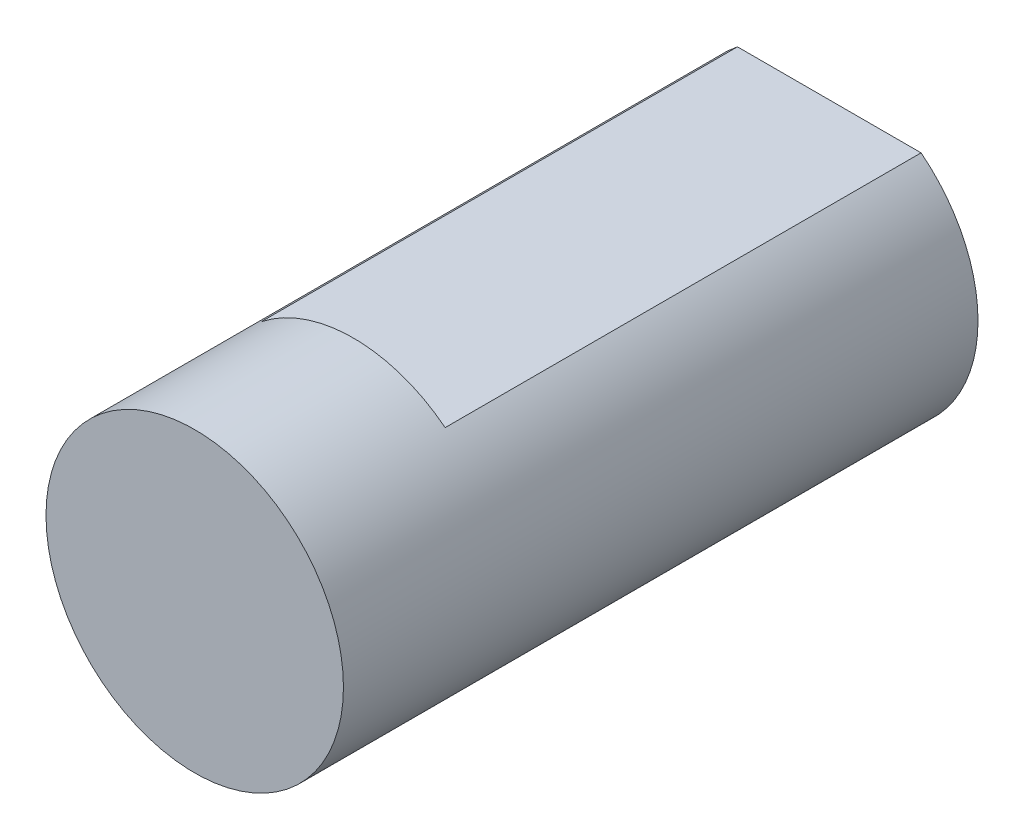
ISO-10303-21;
HEADER;
FILE_DESCRIPTION(('STEP AP214'),'2;1');
FILE_NAME('part.step','',(''),(''),'','','');
FILE_SCHEMA(('AUTOMOTIVE_DESIGN { 1 0 10303 214 1 1 1 1 }'));
ENDSEC;
DATA;
#1=APPLICATION_CONTEXT('core data for automotive mechanical design processes');
#2=APPLICATION_PROTOCOL_DEFINITION('international standard','automotive_design',2000,#1);
#3=PRODUCT_CONTEXT('',#1,'mechanical');
#4=PRODUCT('Part','Part','',(#3));
#5=PRODUCT_RELATED_PRODUCT_CATEGORY('part','',(#4));
#6=PRODUCT_DEFINITION_FORMATION('','',#4);
#7=PRODUCT_DEFINITION_CONTEXT('part definition',#1,'design');
#8=PRODUCT_DEFINITION('design','',#6,#7);
#9=PRODUCT_DEFINITION_SHAPE('','',#8);
#10=(LENGTH_UNIT() NAMED_UNIT(*) SI_UNIT(.MILLI.,.METRE.));
#11=(NAMED_UNIT(*) PLANE_ANGLE_UNIT() SI_UNIT($,.RADIAN.));
#12=(NAMED_UNIT(*) SI_UNIT($,.STERADIAN.) SOLID_ANGLE_UNIT());
#13=UNCERTAINTY_MEASURE_WITH_UNIT(LENGTH_MEASURE(1.E-05),#10,'distance_accuracy_value','');
#14=(GEOMETRIC_REPRESENTATION_CONTEXT(3) GLOBAL_UNCERTAINTY_ASSIGNED_CONTEXT((#13)) GLOBAL_UNIT_ASSIGNED_CONTEXT((#10,
#11,#12)) REPRESENTATION_CONTEXT('',''));
#15=CARTESIAN_POINT('',(0.,0.,0.));
#16=DIRECTION('',(0.,0.,1.));
#17=DIRECTION('',(1.,0.,0.));
#18=AXIS2_PLACEMENT_3D('',#15,#16,#17);
#19=CARTESIAN_POINT('',(0.,0.,-30.48));
#20=DIRECTION('',(0.,0.,1.));
#21=DIRECTION('',(1.,0.,0.));
#22=AXIS2_PLACEMENT_3D('',#19,#20,#21);
#23=CYLINDRICAL_SURFACE('',#22,9.525);
#24=DIRECTION('',(0.,0.,1.));
#25=VECTOR('',#24,1.);
#26=CARTESIAN_POINT('',(5.88052514661744,7.493,-30.48));
#27=LINE('',#26,#25);
#28=CARTESIAN_POINT('',(5.88052514661744,7.493,-30.48));
#29=VERTEX_POINT('',#28);
#30=CARTESIAN_POINT('',(5.88052514661744,7.493,0.));
#31=VERTEX_POINT('',#30);
#32=EDGE_CURVE('E46',#29,#31,#27,.T.);
#33=ORIENTED_EDGE('',*,*,#32,.T.);
#34=CARTESIAN_POINT('',(0.,0.,0.));
#35=DIRECTION('',(0.,0.,1.));
#36=DIRECTION('',(1.,0.,0.));
#37=AXIS2_PLACEMENT_3D('',#34,#35,#36);
#38=CIRCLE('',#37,9.525);
#39=CARTESIAN_POINT('',(-5.88052514661743,7.493,0.));
#40=VERTEX_POINT('',#39);
#41=EDGE_CURVE('E98',#31,#40,#38,.T.);
#42=ORIENTED_EDGE('',*,*,#41,.T.);
#43=DIRECTION('',(0.,0.,1.));
#44=VECTOR('',#43,1.);
#45=CARTESIAN_POINT('',(-5.88052514661744,7.493,-30.48));
#46=LINE('',#45,#44);
#47=CARTESIAN_POINT('',(-5.88052514661744,7.493,-30.48));
#48=VERTEX_POINT('',#47);
#49=EDGE_CURVE('E11',#48,#40,#46,.T.);
#50=ORIENTED_EDGE('',*,*,#49,.F.);
#51=CARTESIAN_POINT('',(0.,0.,-30.48));
#52=DIRECTION('',(0.,0.,1.));
#53=DIRECTION('',(1.,0.,0.));
#54=AXIS2_PLACEMENT_3D('',#51,#52,#53);
#55=CIRCLE('',#54,9.525);
#56=CARTESIAN_POINT('',(-5.88052514661744,-7.493,-30.48));
#57=VERTEX_POINT('',#56);
#58=EDGE_CURVE('E110',#48,#57,#55,.T.);
#59=ORIENTED_EDGE('',*,*,#58,.T.);
#60=DIRECTION('',(0.,0.,1.));
#61=VECTOR('',#60,1.);
#62=CARTESIAN_POINT('',(-5.88052514661744,-7.493,-30.48));
#63=LINE('',#62,#61);
#64=CARTESIAN_POINT('',(-5.88052514661744,-7.493,0.));
#65=VERTEX_POINT('',#64);
#66=EDGE_CURVE('E77',#57,#65,#63,.T.);
#67=ORIENTED_EDGE('',*,*,#66,.T.);
#68=CARTESIAN_POINT('',(5.88052514661743,-7.493,0.));
#69=VERTEX_POINT('',#68);
#70=EDGE_CURVE('E94',#65,#69,#38,.T.);
#71=ORIENTED_EDGE('',*,*,#70,.T.);
#72=DIRECTION('',(0.,0.,1.));
#73=VECTOR('',#72,1.);
#74=CARTESIAN_POINT('',(5.88052514661743,-7.493,-30.48));
#75=LINE('',#74,#73);
#76=CARTESIAN_POINT('',(5.88052514661743,-7.493,-30.48));
#77=VERTEX_POINT('',#76);
#78=EDGE_CURVE('E69',#77,#69,#75,.T.);
#79=ORIENTED_EDGE('',*,*,#78,.F.);
#80=CARTESIAN_POINT('',(0.,0.,-30.48));
#81=DIRECTION('',(0.,0.,1.));
#82=DIRECTION('',(1.,0.,0.));
#83=AXIS2_PLACEMENT_3D('',#80,#81,#82);
#84=CIRCLE('',#83,9.525);
#85=EDGE_CURVE('E115',#77,#29,#84,.T.);
#86=ORIENTED_EDGE('',*,*,#85,.T.);
#87=EDGE_LOOP('',(#33,#42,#50,#59,#67,#71,#79,#86));
#88=FACE_BOUND('',#87,.T.);
#89=CARTESIAN_POINT('',(0.,0.,10.16));
#90=DIRECTION('',(0.,0.,1.));
#91=DIRECTION('',(1.,0.,0.));
#92=AXIS2_PLACEMENT_3D('',#89,#90,#91);
#93=CIRCLE('',#92,9.525);
#94=CARTESIAN_POINT('',(9.525,0.,10.16));
#95=VERTEX_POINT('',#94);
#96=EDGE_CURVE('E101',#95,#95,#93,.T.);
#97=ORIENTED_EDGE('',*,*,#96,.F.);
#98=EDGE_LOOP('',(#97));
#99=FACE_BOUND('',#98,.T.);
#100=ADVANCED_FACE('F36',(#88,#99),#23,.T.);
#101=CARTESIAN_POINT('',(-5.88052514661744,7.493,-30.48));
#102=DIRECTION('',(0.,1.,0.));
#103=DIRECTION('',(0.,0.,1.));
#104=AXIS2_PLACEMENT_3D('',#101,#102,#103);
#105=PLANE('',#104);
#106=DIRECTION('',(-1.,0.,0.));
#107=VECTOR('',#106,1.);
#108=CARTESIAN_POINT('',(-5.88052514661744,7.493,0.));
#109=LINE('',#108,#107);
#110=EDGE_CURVE('E113',#31,#40,#109,.T.);
#111=ORIENTED_EDGE('',*,*,#110,.F.);
#112=ORIENTED_EDGE('',*,*,#32,.F.);
#113=DIRECTION('',(-1.,0.,0.));
#114=VECTOR('',#113,1.);
#115=CARTESIAN_POINT('',(-5.88052514661744,7.493,-30.48));
#116=LINE('',#115,#114);
#117=EDGE_CURVE('E117',#29,#48,#116,.T.);
#118=ORIENTED_EDGE('',*,*,#117,.T.);
#119=ORIENTED_EDGE('',*,*,#49,.T.);
#120=EDGE_LOOP('',(#111,#112,#118,#119));
#121=FACE_BOUND('',#120,.T.);
#122=ADVANCED_FACE('F139',(#121),#105,.T.);
#123=CARTESIAN_POINT('',(-5.88052514661744,-7.493,-30.48));
#124=DIRECTION('',(0.,-1.,0.));
#125=DIRECTION('',(0.,0.,-1.));
#126=AXIS2_PLACEMENT_3D('',#123,#124,#125);
#127=PLANE('',#126);
#128=DIRECTION('',(1.,0.,0.));
#129=VECTOR('',#128,1.);
#130=CARTESIAN_POINT('',(-5.88052514661744,-7.493,0.));
#131=LINE('',#130,#129);
#132=EDGE_CURVE('E106',#65,#69,#131,.T.);
#133=ORIENTED_EDGE('',*,*,#132,.F.);
#134=ORIENTED_EDGE('',*,*,#66,.F.);
#135=DIRECTION('',(1.,0.,0.));
#136=VECTOR('',#135,1.);
#137=CARTESIAN_POINT('',(-5.88052514661744,-7.493,-30.48));
#138=LINE('',#137,#136);
#139=EDGE_CURVE('E112',#57,#77,#138,.T.);
#140=ORIENTED_EDGE('',*,*,#139,.T.);
#141=ORIENTED_EDGE('',*,*,#78,.T.);
#142=EDGE_LOOP('',(#133,#134,#140,#141));
#143=FACE_BOUND('',#142,.T.);
#144=ADVANCED_FACE('F38',(#143),#127,.T.);
#145=CARTESIAN_POINT('',(0.,0.,-30.48));
#146=DIRECTION('',(0.,0.,1.));
#147=DIRECTION('',(1.,0.,0.));
#148=AXIS2_PLACEMENT_3D('',#145,#146,#147);
#149=PLANE('',#148);
#150=CARTESIAN_POINT('',(0.,0.,-30.48));
#151=DIRECTION('',(0.,0.,-1.));
#152=DIRECTION('',(-1.,0.,0.));
#153=AXIS2_PLACEMENT_3D('',#150,#151,#152);
#154=CIRCLE('',#153,5.35813);
#155=CARTESIAN_POINT('',(-5.35813,0.,-30.48));
#156=VERTEX_POINT('',#155);
#157=EDGE_CURVE('E95',#156,#156,#154,.T.);
#158=ORIENTED_EDGE('',*,*,#157,.F.);
#159=EDGE_LOOP('',(#158));
#160=FACE_BOUND('',#159,.T.);
#161=ORIENTED_EDGE('',*,*,#58,.F.);
#162=ORIENTED_EDGE('',*,*,#117,.F.);
#163=ORIENTED_EDGE('',*,*,#85,.F.);
#164=ORIENTED_EDGE('',*,*,#139,.F.);
#165=EDGE_LOOP('',(#161,#162,#163,#164));
#166=FACE_BOUND('',#165,.T.);
#167=ADVANCED_FACE('F154',(#160,#166),#149,.F.);
#168=CARTESIAN_POINT('',(0.,0.,0.));
#169=DIRECTION('',(0.,0.,1.));
#170=DIRECTION('',(1.,0.,0.));
#171=AXIS2_PLACEMENT_3D('',#168,#169,#170);
#172=PLANE('',#171);
#173=ORIENTED_EDGE('',*,*,#70,.F.);
#174=ORIENTED_EDGE('',*,*,#132,.T.);
#175=EDGE_LOOP('',(#173,#174));
#176=FACE_BOUND('',#175,.T.);
#177=ADVANCED_FACE('F151',(#176),#172,.F.);
#178=ORIENTED_EDGE('',*,*,#41,.F.);
#179=ORIENTED_EDGE('',*,*,#110,.T.);
#180=EDGE_LOOP('',(#178,#179));
#181=FACE_BOUND('',#180,.T.);
#182=ADVANCED_FACE('F88',(#181),#172,.F.);
#183=CARTESIAN_POINT('',(0.,0.,0.779779999999997));
#184=DIRECTION('',(0.,0.,-1.));
#185=DIRECTION('',(-1.,0.,0.));
#186=AXIS2_PLACEMENT_3D('',#183,#184,#185);
#187=CONICAL_SURFACE('',#186,5.35812999999999,1.02974425867665);
#188=CARTESIAN_POINT('',(0.,0.,3.99926930863014));
#189=VERTEX_POINT('',#188);
#190=VERTEX_LOOP('',#189);
#191=FACE_BOUND('',#190,.T.);
#192=CARTESIAN_POINT('',(0.,0.,0.779779999999997));
#193=DIRECTION('',(0.,0.,-1.));
#194=DIRECTION('',(-1.,0.,0.));
#195=AXIS2_PLACEMENT_3D('',#192,#193,#194);
#196=CIRCLE('',#195,5.35812999999999);
#197=CARTESIAN_POINT('',(-5.35812999999999,0.,0.779779999999997));
#198=VERTEX_POINT('',#197);
#199=EDGE_CURVE('E92',#198,#198,#196,.T.);
#200=ORIENTED_EDGE('',*,*,#199,.T.);
#201=EDGE_LOOP('',(#200));
#202=FACE_BOUND('',#201,.T.);
#203=ADVANCED_FACE('F84',(#191,#202),#187,.F.);
#204=CARTESIAN_POINT('',(0.,0.,-30.48));
#205=DIRECTION('',(0.,0.,-1.));
#206=DIRECTION('',(-1.,0.,0.));
#207=AXIS2_PLACEMENT_3D('',#204,#205,#206);
#208=CYLINDRICAL_SURFACE('',#207,5.35813);
#209=ORIENTED_EDGE('',*,*,#199,.F.);
#210=EDGE_LOOP('',(#209));
#211=FACE_BOUND('',#210,.T.);
#212=ORIENTED_EDGE('',*,*,#157,.T.);
#213=EDGE_LOOP('',(#212));
#214=FACE_BOUND('',#213,.T.);
#215=ADVANCED_FACE('F87',(#211,#214),#208,.F.);
#216=CARTESIAN_POINT('',(0.,0.,10.16));
#217=DIRECTION('',(0.,0.,1.));
#218=DIRECTION('',(1.,0.,0.));
#219=AXIS2_PLACEMENT_3D('',#216,#217,#218);
#220=PLANE('',#219);
#221=ORIENTED_EDGE('',*,*,#96,.T.);
#222=EDGE_LOOP('',(#221));
#223=FACE_BOUND('',#222,.T.);
#224=ADVANCED_FACE('F143',(#223),#220,.T.);
#225=CLOSED_SHELL('',(#100,#122,#144,#167,#177,#182,#203,#215,#224));
#226=MANIFOLD_SOLID_BREP('B2',#225);
#227=ADVANCED_BREP_SHAPE_REPRESENTATION('',(#18,#226),#14);
#228=SHAPE_DEFINITION_REPRESENTATION(#9,#227);
ENDSEC;
END-ISO-10303-21;
